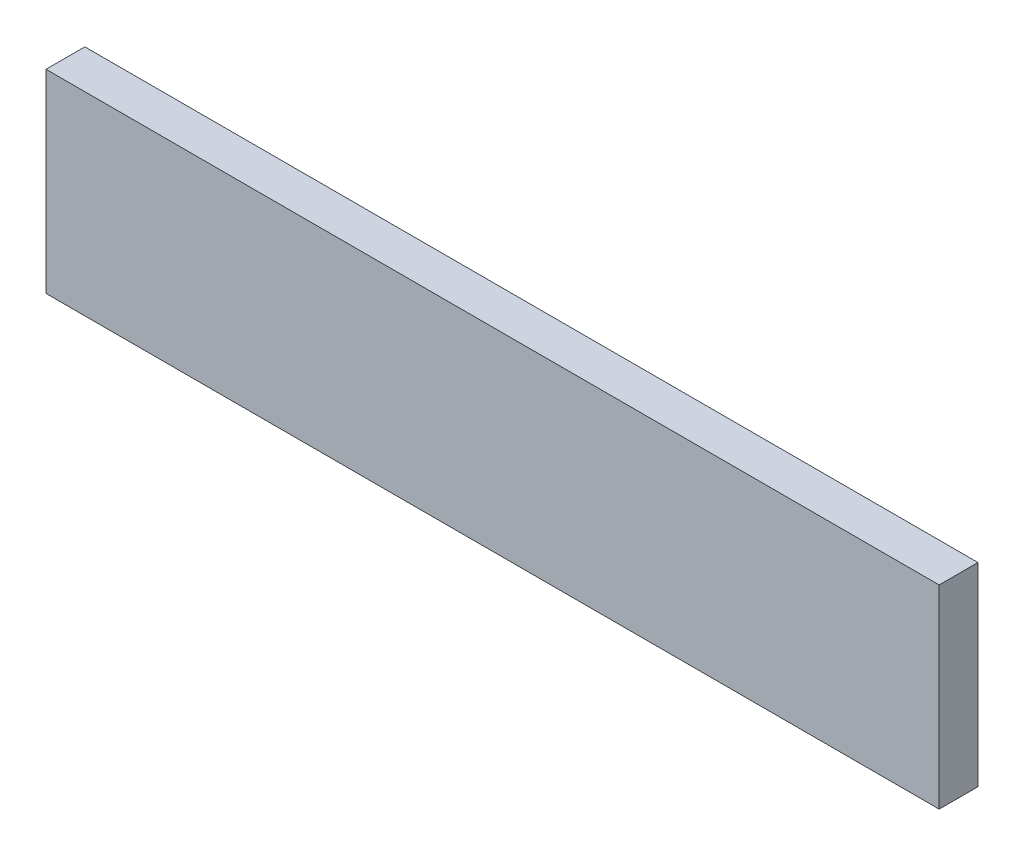
ISO-10303-21;
HEADER;
FILE_DESCRIPTION(('STEP AP214'),'2;1');
FILE_NAME('part.step','',(''),(''),'','','');
FILE_SCHEMA(('AUTOMOTIVE_DESIGN { 1 0 10303 214 1 1 1 1 }'));
ENDSEC;
DATA;
#1=APPLICATION_CONTEXT('core data for automotive mechanical design processes');
#2=APPLICATION_PROTOCOL_DEFINITION('international standard','automotive_design',2000,#1);
#3=PRODUCT_CONTEXT('',#1,'mechanical');
#4=PRODUCT('Part','Part','',(#3));
#5=PRODUCT_RELATED_PRODUCT_CATEGORY('part','',(#4));
#6=PRODUCT_DEFINITION_FORMATION('','',#4);
#7=PRODUCT_DEFINITION_CONTEXT('part definition',#1,'design');
#8=PRODUCT_DEFINITION('design','',#6,#7);
#9=PRODUCT_DEFINITION_SHAPE('','',#8);
#10=(LENGTH_UNIT() NAMED_UNIT(*) SI_UNIT(.MILLI.,.METRE.));
#11=(NAMED_UNIT(*) PLANE_ANGLE_UNIT() SI_UNIT($,.RADIAN.));
#12=(NAMED_UNIT(*) SI_UNIT($,.STERADIAN.) SOLID_ANGLE_UNIT());
#13=UNCERTAINTY_MEASURE_WITH_UNIT(LENGTH_MEASURE(1.E-05),#10,'distance_accuracy_value','');
#14=(GEOMETRIC_REPRESENTATION_CONTEXT(3) GLOBAL_UNCERTAINTY_ASSIGNED_CONTEXT((#13)) GLOBAL_UNIT_ASSIGNED_CONTEXT((#10,
#11,#12)) REPRESENTATION_CONTEXT('',''));
#15=CARTESIAN_POINT('',(0.,0.,0.));
#16=DIRECTION('',(0.,0.,1.));
#17=DIRECTION('',(1.,0.,0.));
#18=AXIS2_PLACEMENT_3D('',#15,#16,#17);
#19=CARTESIAN_POINT('',(0.,0.,10.));
#20=DIRECTION('',(1.,0.,0.));
#21=DIRECTION('',(0.,0.,-1.));
#22=AXIS2_PLACEMENT_3D('',#19,#20,#21);
#23=PLANE('',#22);
#24=DIRECTION('',(0.,-1.,0.));
#25=VECTOR('',#24,1.);
#26=CARTESIAN_POINT('',(0.,0.,0.));
#27=LINE('',#26,#25);
#28=CARTESIAN_POINT('',(0.,50.,0.));
#29=VERTEX_POINT('',#28);
#30=CARTESIAN_POINT('',(0.,0.,0.));
#31=VERTEX_POINT('',#30);
#32=EDGE_CURVE('E98',#29,#31,#27,.T.);
#33=ORIENTED_EDGE('',*,*,#32,.T.);
#34=DIRECTION('',(0.,0.,-1.));
#35=VECTOR('',#34,1.);
#36=CARTESIAN_POINT('',(0.,0.,10.));
#37=LINE('',#36,#35);
#38=CARTESIAN_POINT('',(0.,0.,10.));
#39=VERTEX_POINT('',#38);
#40=EDGE_CURVE('E11',#39,#31,#37,.T.);
#41=ORIENTED_EDGE('',*,*,#40,.F.);
#42=DIRECTION('',(0.,-1.,0.));
#43=VECTOR('',#42,1.);
#44=CARTESIAN_POINT('',(0.,0.,10.));
#45=LINE('',#44,#43);
#46=CARTESIAN_POINT('',(0.,50.,10.));
#47=VERTEX_POINT('',#46);
#48=EDGE_CURVE('E86',#47,#39,#45,.T.);
#49=ORIENTED_EDGE('',*,*,#48,.F.);
#50=DIRECTION('',(0.,0.,-1.));
#51=VECTOR('',#50,1.);
#52=CARTESIAN_POINT('',(0.,50.,10.));
#53=LINE('',#52,#51);
#54=EDGE_CURVE('E94',#47,#29,#53,.T.);
#55=ORIENTED_EDGE('',*,*,#54,.T.);
#56=EDGE_LOOP('',(#33,#41,#49,#55));
#57=FACE_BOUND('',#56,.T.);
#58=ADVANCED_FACE('F35',(#57),#23,.F.);
#59=CARTESIAN_POINT('',(0.,0.,10.));
#60=DIRECTION('',(0.,1.,0.));
#61=DIRECTION('',(0.,0.,1.));
#62=AXIS2_PLACEMENT_3D('',#59,#60,#61);
#63=PLANE('',#62);
#64=DIRECTION('',(1.,0.,0.));
#65=VECTOR('',#64,1.);
#66=CARTESIAN_POINT('',(0.,0.,0.));
#67=LINE('',#66,#65);
#68=CARTESIAN_POINT('',(230.,0.,0.));
#69=VERTEX_POINT('',#68);
#70=EDGE_CURVE('E90',#31,#69,#67,.T.);
#71=ORIENTED_EDGE('',*,*,#70,.T.);
#72=DIRECTION('',(0.,0.,-1.));
#73=VECTOR('',#72,1.);
#74=CARTESIAN_POINT('',(230.,0.,10.));
#75=LINE('',#74,#73);
#76=CARTESIAN_POINT('',(230.,0.,10.));
#77=VERTEX_POINT('',#76);
#78=EDGE_CURVE('E43',#77,#69,#75,.T.);
#79=ORIENTED_EDGE('',*,*,#78,.F.);
#80=DIRECTION('',(1.,0.,0.));
#81=VECTOR('',#80,1.);
#82=CARTESIAN_POINT('',(0.,0.,10.));
#83=LINE('',#82,#81);
#84=EDGE_CURVE('E81',#39,#77,#83,.T.);
#85=ORIENTED_EDGE('',*,*,#84,.F.);
#86=ORIENTED_EDGE('',*,*,#40,.T.);
#87=EDGE_LOOP('',(#71,#79,#85,#86));
#88=FACE_BOUND('',#87,.T.);
#89=ADVANCED_FACE('F89',(#88),#63,.F.);
#90=CARTESIAN_POINT('',(230.,0.,10.));
#91=DIRECTION('',(-1.,0.,0.));
#92=DIRECTION('',(0.,0.,1.));
#93=AXIS2_PLACEMENT_3D('',#90,#91,#92);
#94=PLANE('',#93);
#95=DIRECTION('',(0.,1.,0.));
#96=VECTOR('',#95,1.);
#97=CARTESIAN_POINT('',(230.,0.,0.));
#98=LINE('',#97,#96);
#99=CARTESIAN_POINT('',(230.,50.,0.));
#100=VERTEX_POINT('',#99);
#101=EDGE_CURVE('E68',#69,#100,#98,.T.);
#102=ORIENTED_EDGE('',*,*,#101,.T.);
#103=DIRECTION('',(0.,0.,-1.));
#104=VECTOR('',#103,1.);
#105=CARTESIAN_POINT('',(230.,50.,10.));
#106=LINE('',#105,#104);
#107=CARTESIAN_POINT('',(230.,50.,10.));
#108=VERTEX_POINT('',#107);
#109=EDGE_CURVE('E91',#108,#100,#106,.T.);
#110=ORIENTED_EDGE('',*,*,#109,.F.);
#111=DIRECTION('',(0.,1.,0.));
#112=VECTOR('',#111,1.);
#113=CARTESIAN_POINT('',(230.,0.,10.));
#114=LINE('',#113,#112);
#115=EDGE_CURVE('E84',#77,#108,#114,.T.);
#116=ORIENTED_EDGE('',*,*,#115,.F.);
#117=ORIENTED_EDGE('',*,*,#78,.T.);
#118=EDGE_LOOP('',(#102,#110,#116,#117));
#119=FACE_BOUND('',#118,.T.);
#120=ADVANCED_FACE('F92',(#119),#94,.F.);
#121=CARTESIAN_POINT('',(0.,50.,10.));
#122=DIRECTION('',(0.,-1.,0.));
#123=DIRECTION('',(0.,0.,-1.));
#124=AXIS2_PLACEMENT_3D('',#121,#122,#123);
#125=PLANE('',#124);
#126=DIRECTION('',(-1.,0.,0.));
#127=VECTOR('',#126,1.);
#128=CARTESIAN_POINT('',(0.,50.,0.));
#129=LINE('',#128,#127);
#130=EDGE_CURVE('E74',#100,#29,#129,.T.);
#131=ORIENTED_EDGE('',*,*,#130,.T.);
#132=ORIENTED_EDGE('',*,*,#54,.F.);
#133=DIRECTION('',(-1.,0.,0.));
#134=VECTOR('',#133,1.);
#135=CARTESIAN_POINT('',(0.,50.,10.));
#136=LINE('',#135,#134);
#137=EDGE_CURVE('E51',#108,#47,#136,.T.);
#138=ORIENTED_EDGE('',*,*,#137,.F.);
#139=ORIENTED_EDGE('',*,*,#109,.T.);
#140=EDGE_LOOP('',(#131,#132,#138,#139));
#141=FACE_BOUND('',#140,.T.);
#142=ADVANCED_FACE('F105',(#141),#125,.F.);
#143=CARTESIAN_POINT('',(0.,0.,10.));
#144=DIRECTION('',(0.,0.,-1.));
#145=DIRECTION('',(-1.,0.,0.));
#146=AXIS2_PLACEMENT_3D('',#143,#144,#145);
#147=PLANE('',#146);
#148=ORIENTED_EDGE('',*,*,#48,.T.);
#149=ORIENTED_EDGE('',*,*,#84,.T.);
#150=ORIENTED_EDGE('',*,*,#115,.T.);
#151=ORIENTED_EDGE('',*,*,#137,.T.);
#152=EDGE_LOOP('',(#148,#149,#150,#151));
#153=FACE_BOUND('',#152,.T.);
#154=ADVANCED_FACE('F82',(#153),#147,.F.);
#155=CARTESIAN_POINT('',(0.,0.,0.));
#156=DIRECTION('',(0.,0.,-1.));
#157=DIRECTION('',(-1.,0.,0.));
#158=AXIS2_PLACEMENT_3D('',#155,#156,#157);
#159=PLANE('',#158);
#160=ORIENTED_EDGE('',*,*,#32,.F.);
#161=ORIENTED_EDGE('',*,*,#130,.F.);
#162=ORIENTED_EDGE('',*,*,#101,.F.);
#163=ORIENTED_EDGE('',*,*,#70,.F.);
#164=EDGE_LOOP('',(#160,#161,#162,#163));
#165=FACE_BOUND('',#164,.T.);
#166=ADVANCED_FACE('F108',(#165),#159,.T.);
#167=CLOSED_SHELL('',(#58,#89,#120,#142,#154,#166));
#168=MANIFOLD_SOLID_BREP('B2',#167);
#169=ADVANCED_BREP_SHAPE_REPRESENTATION('',(#18,#168),#14);
#170=SHAPE_DEFINITION_REPRESENTATION(#9,#169);
ENDSEC;
END-ISO-10303-21;
